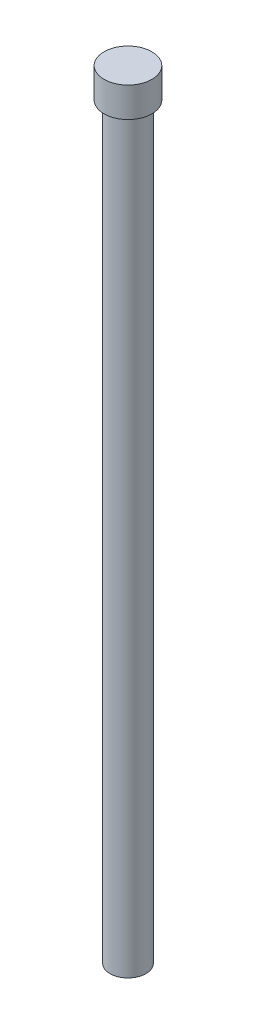
ISO-10303-21;
HEADER;
FILE_DESCRIPTION(('STEP AP214'),'2;1');
FILE_NAME('part.step','',(''),(''),'','','');
FILE_SCHEMA(('AUTOMOTIVE_DESIGN { 1 0 10303 214 1 1 1 1 }'));
ENDSEC;
DATA;
#1=APPLICATION_CONTEXT('core data for automotive mechanical design processes');
#2=APPLICATION_PROTOCOL_DEFINITION('international standard','automotive_design',2000,#1);
#3=PRODUCT_CONTEXT('',#1,'mechanical');
#4=PRODUCT('Part','Part','',(#3));
#5=PRODUCT_RELATED_PRODUCT_CATEGORY('part','',(#4));
#6=PRODUCT_DEFINITION_FORMATION('','',#4);
#7=PRODUCT_DEFINITION_CONTEXT('part definition',#1,'design');
#8=PRODUCT_DEFINITION('design','',#6,#7);
#9=PRODUCT_DEFINITION_SHAPE('','',#8);
#10=(LENGTH_UNIT() NAMED_UNIT(*) SI_UNIT(.MILLI.,.METRE.));
#11=(NAMED_UNIT(*) PLANE_ANGLE_UNIT() SI_UNIT($,.RADIAN.));
#12=(NAMED_UNIT(*) SI_UNIT($,.STERADIAN.) SOLID_ANGLE_UNIT());
#13=UNCERTAINTY_MEASURE_WITH_UNIT(LENGTH_MEASURE(1.E-05),#10,'distance_accuracy_value','');
#14=(GEOMETRIC_REPRESENTATION_CONTEXT(3) GLOBAL_UNCERTAINTY_ASSIGNED_CONTEXT((#13)) GLOBAL_UNIT_ASSIGNED_CONTEXT((#10,
#11,#12)) REPRESENTATION_CONTEXT('',''));
#15=CARTESIAN_POINT('',(0.,0.,0.));
#16=DIRECTION('',(0.,0.,1.));
#17=DIRECTION('',(1.,0.,0.));
#18=AXIS2_PLACEMENT_3D('',#15,#16,#17);
#19=CARTESIAN_POINT('',(0.,31.75,0.));
#20=DIRECTION('',(0.,-1.,0.));
#21=DIRECTION('',(0.,0.,-1.));
#22=AXIS2_PLACEMENT_3D('',#19,#20,#21);
#23=CYLINDRICAL_SURFACE('',#22,0.762);
#24=CARTESIAN_POINT('',(0.,31.75,0.));
#25=DIRECTION('',(0.,1.,0.));
#26=DIRECTION('',(0.,0.,1.));
#27=AXIS2_PLACEMENT_3D('',#24,#25,#26);
#28=CIRCLE('',#27,0.762);
#29=CARTESIAN_POINT('',(0.,31.75,0.762));
#30=VERTEX_POINT('',#29);
#31=EDGE_CURVE('E10',#30,#30,#28,.T.);
#32=ORIENTED_EDGE('',*,*,#31,.F.);
#33=EDGE_LOOP('',(#32));
#34=FACE_BOUND('',#33,.T.);
#35=CARTESIAN_POINT('',(0.,0.,0.));
#36=DIRECTION('',(0.,1.,0.));
#37=DIRECTION('',(0.,0.,1.));
#38=AXIS2_PLACEMENT_3D('',#35,#36,#37);
#39=CIRCLE('',#38,0.762);
#40=CARTESIAN_POINT('',(0.,0.,0.762));
#41=VERTEX_POINT('',#40);
#42=EDGE_CURVE('E35',#41,#41,#39,.T.);
#43=ORIENTED_EDGE('',*,*,#42,.T.);
#44=EDGE_LOOP('',(#43));
#45=FACE_BOUND('',#44,.T.);
#46=ADVANCED_FACE('F32',(#34,#45),#23,.T.);
#47=CARTESIAN_POINT('',(0.,0.,0.));
#48=DIRECTION('',(0.,1.,0.));
#49=DIRECTION('',(0.,0.,1.));
#50=AXIS2_PLACEMENT_3D('',#47,#48,#49);
#51=PLANE('',#50);
#52=ORIENTED_EDGE('',*,*,#42,.F.);
#53=EDGE_LOOP('',(#52));
#54=FACE_BOUND('',#53,.T.);
#55=ADVANCED_FACE('F55',(#54),#51,.F.);
#56=CARTESIAN_POINT('',(0.,33.02,0.));
#57=DIRECTION('',(0.,-1.,0.));
#58=DIRECTION('',(0.,0.,-1.));
#59=AXIS2_PLACEMENT_3D('',#56,#57,#58);
#60=CYLINDRICAL_SURFACE('',#59,1.016);
#61=CARTESIAN_POINT('',(0.,33.02,0.));
#62=DIRECTION('',(0.,1.,0.));
#63=DIRECTION('',(0.,0.,1.));
#64=AXIS2_PLACEMENT_3D('',#61,#62,#63);
#65=CIRCLE('',#64,1.016);
#66=CARTESIAN_POINT('',(0.,33.02,1.016));
#67=VERTEX_POINT('',#66);
#68=EDGE_CURVE('E42',#67,#67,#65,.T.);
#69=ORIENTED_EDGE('',*,*,#68,.F.);
#70=EDGE_LOOP('',(#69));
#71=FACE_BOUND('',#70,.T.);
#72=CARTESIAN_POINT('',(0.,31.75,0.));
#73=DIRECTION('',(0.,1.,0.));
#74=DIRECTION('',(0.,0.,1.));
#75=AXIS2_PLACEMENT_3D('',#72,#73,#74);
#76=CIRCLE('',#75,1.016);
#77=CARTESIAN_POINT('',(0.,31.75,1.016));
#78=VERTEX_POINT('',#77);
#79=EDGE_CURVE('E44',#78,#78,#76,.T.);
#80=ORIENTED_EDGE('',*,*,#79,.T.);
#81=EDGE_LOOP('',(#80));
#82=FACE_BOUND('',#81,.T.);
#83=ADVANCED_FACE('F52',(#71,#82),#60,.T.);
#84=CARTESIAN_POINT('',(0.,33.02,0.));
#85=DIRECTION('',(0.,1.,0.));
#86=DIRECTION('',(0.,0.,1.));
#87=AXIS2_PLACEMENT_3D('',#84,#85,#86);
#88=PLANE('',#87);
#89=ORIENTED_EDGE('',*,*,#68,.T.);
#90=EDGE_LOOP('',(#89));
#91=FACE_BOUND('',#90,.T.);
#92=ADVANCED_FACE('F50',(#91),#88,.T.);
#93=CARTESIAN_POINT('',(0.,31.75,0.));
#94=DIRECTION('',(0.,1.,0.));
#95=DIRECTION('',(0.,0.,1.));
#96=AXIS2_PLACEMENT_3D('',#93,#94,#95);
#97=PLANE('',#96);
#98=ORIENTED_EDGE('',*,*,#31,.T.);
#99=EDGE_LOOP('',(#98));
#100=FACE_BOUND('',#99,.T.);
#101=ORIENTED_EDGE('',*,*,#79,.F.);
#102=EDGE_LOOP('',(#101));
#103=FACE_BOUND('',#102,.T.);
#104=ADVANCED_FACE('F59',(#100,#103),#97,.F.);
#105=CLOSED_SHELL('',(#46,#55,#83,#92,#104));
#106=MANIFOLD_SOLID_BREP('B2',#105);
#107=ADVANCED_BREP_SHAPE_REPRESENTATION('',(#18,#106),#14);
#108=SHAPE_DEFINITION_REPRESENTATION(#9,#107);
ENDSEC;
END-ISO-10303-21;
